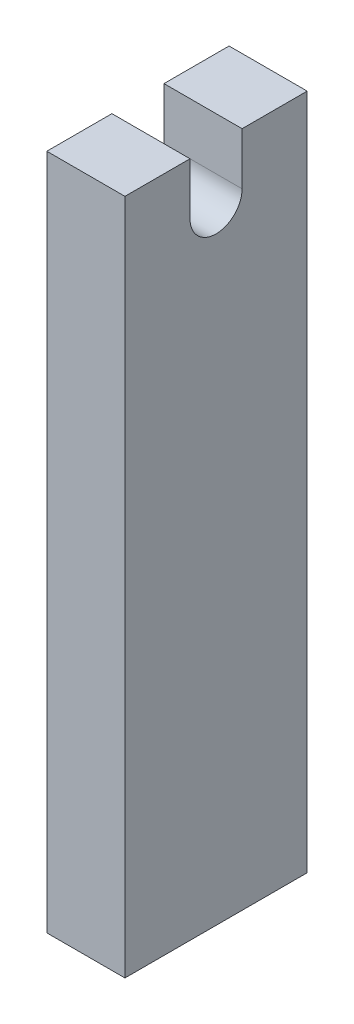
ISO-10303-21;
HEADER;
FILE_DESCRIPTION(('STEP AP214'),'2;1');
FILE_NAME('part.step','',(''),(''),'','','');
FILE_SCHEMA(('AUTOMOTIVE_DESIGN { 1 0 10303 214 1 1 1 1 }'));
ENDSEC;
DATA;
#1=APPLICATION_CONTEXT('core data for automotive mechanical design processes');
#2=APPLICATION_PROTOCOL_DEFINITION('international standard','automotive_design',2000,#1);
#3=PRODUCT_CONTEXT('',#1,'mechanical');
#4=PRODUCT('Part','Part','',(#3));
#5=PRODUCT_RELATED_PRODUCT_CATEGORY('part','',(#4));
#6=PRODUCT_DEFINITION_FORMATION('','',#4);
#7=PRODUCT_DEFINITION_CONTEXT('part definition',#1,'design');
#8=PRODUCT_DEFINITION('design','',#6,#7);
#9=PRODUCT_DEFINITION_SHAPE('','',#8);
#10=(LENGTH_UNIT() NAMED_UNIT(*) SI_UNIT(.MILLI.,.METRE.));
#11=(NAMED_UNIT(*) PLANE_ANGLE_UNIT() SI_UNIT($,.RADIAN.));
#12=(NAMED_UNIT(*) SI_UNIT($,.STERADIAN.) SOLID_ANGLE_UNIT());
#13=UNCERTAINTY_MEASURE_WITH_UNIT(LENGTH_MEASURE(1.E-05),#10,'distance_accuracy_value','');
#14=(GEOMETRIC_REPRESENTATION_CONTEXT(3) GLOBAL_UNCERTAINTY_ASSIGNED_CONTEXT((#13)) GLOBAL_UNIT_ASSIGNED_CONTEXT((#10,
#11,#12)) REPRESENTATION_CONTEXT('',''));
#15=CARTESIAN_POINT('',(0.,0.,0.));
#16=DIRECTION('',(0.,0.,1.));
#17=DIRECTION('',(1.,0.,0.));
#18=AXIS2_PLACEMENT_3D('',#15,#16,#17);
#19=CARTESIAN_POINT('',(0.,330.2,0.));
#20=DIRECTION('',(0.,-1.,0.));
#21=DIRECTION('',(0.,0.,-1.));
#22=AXIS2_PLACEMENT_3D('',#19,#20,#21);
#23=PLANE('',#22);
#24=DIRECTION('',(0.,0.,1.));
#25=VECTOR('',#24,1.);
#26=CARTESIAN_POINT('',(0.,330.2,0.));
#27=LINE('',#26,#25);
#28=CARTESIAN_POINT('',(0.,330.2,-88.9));
#29=VERTEX_POINT('',#28);
#30=CARTESIAN_POINT('',(0.,330.2,-57.15));
#31=VERTEX_POINT('',#30);
#32=EDGE_CURVE('E181',#29,#31,#27,.T.);
#33=ORIENTED_EDGE('',*,*,#32,.T.);
#34=DIRECTION('',(1.,0.,0.));
#35=VECTOR('',#34,1.);
#36=CARTESIAN_POINT('',(0.,330.2,-57.15));
#37=LINE('',#36,#35);
#38=CARTESIAN_POINT('',(38.1,330.2,-57.15));
#39=VERTEX_POINT('',#38);
#40=EDGE_CURVE('E11',#31,#39,#37,.T.);
#41=ORIENTED_EDGE('',*,*,#40,.T.);
#42=DIRECTION('',(0.,0.,-1.));
#43=VECTOR('',#42,1.);
#44=CARTESIAN_POINT('',(38.1,330.2,0.));
#45=LINE('',#44,#43);
#46=CARTESIAN_POINT('',(38.1,330.2,-88.9));
#47=VERTEX_POINT('',#46);
#48=EDGE_CURVE('E136',#39,#47,#45,.T.);
#49=ORIENTED_EDGE('',*,*,#48,.T.);
#50=DIRECTION('',(-1.,0.,0.));
#51=VECTOR('',#50,1.);
#52=CARTESIAN_POINT('',(0.,330.2,-88.9));
#53=LINE('',#52,#51);
#54=EDGE_CURVE('E64',#47,#29,#53,.T.);
#55=ORIENTED_EDGE('',*,*,#54,.T.);
#56=EDGE_LOOP('',(#33,#41,#49,#55));
#57=FACE_BOUND('',#56,.T.);
#58=ADVANCED_FACE('F39',(#57),#23,.F.);
#59=CARTESIAN_POINT('',(0.,330.2,0.));
#60=DIRECTION('',(1.,0.,0.));
#61=DIRECTION('',(0.,0.,-1.));
#62=AXIS2_PLACEMENT_3D('',#59,#60,#61);
#63=PLANE('',#62);
#64=CARTESIAN_POINT('',(0.,304.8,-44.45));
#65=DIRECTION('',(1.,0.,0.));
#66=DIRECTION('',(0.,0.,-1.));
#67=AXIS2_PLACEMENT_3D('',#64,#65,#66);
#68=CIRCLE('',#67,12.7);
#69=CARTESIAN_POINT('',(0.,304.8,-31.75));
#70=VERTEX_POINT('',#69);
#71=CARTESIAN_POINT('',(0.,304.8,-57.15));
#72=VERTEX_POINT('',#71);
#73=EDGE_CURVE('E150',#70,#72,#68,.T.);
#74=ORIENTED_EDGE('',*,*,#73,.T.);
#75=DIRECTION('',(0.,1.,0.));
#76=VECTOR('',#75,1.);
#77=CARTESIAN_POINT('',(0.,330.2,-57.15));
#78=LINE('',#77,#76);
#79=EDGE_CURVE('E182',#72,#31,#78,.T.);
#80=ORIENTED_EDGE('',*,*,#79,.T.);
#81=ORIENTED_EDGE('',*,*,#32,.F.);
#82=DIRECTION('',(0.,-1.,0.));
#83=VECTOR('',#82,1.);
#84=CARTESIAN_POINT('',(0.,330.2,-88.9));
#85=LINE('',#84,#83);
#86=CARTESIAN_POINT('',(0.,0.,-88.9));
#87=VERTEX_POINT('',#86);
#88=EDGE_CURVE('E140',#29,#87,#85,.T.);
#89=ORIENTED_EDGE('',*,*,#88,.T.);
#90=DIRECTION('',(0.,0.,1.));
#91=VECTOR('',#90,1.);
#92=CARTESIAN_POINT('',(0.,0.,0.));
#93=LINE('',#92,#91);
#94=CARTESIAN_POINT('',(0.,0.,0.));
#95=VERTEX_POINT('',#94);
#96=EDGE_CURVE('E145',#87,#95,#93,.T.);
#97=ORIENTED_EDGE('',*,*,#96,.T.);
#98=DIRECTION('',(0.,-1.,0.));
#99=VECTOR('',#98,1.);
#100=CARTESIAN_POINT('',(0.,330.2,0.));
#101=LINE('',#100,#99);
#102=CARTESIAN_POINT('',(0.,330.2,0.));
#103=VERTEX_POINT('',#102);
#104=EDGE_CURVE('E120',#103,#95,#101,.T.);
#105=ORIENTED_EDGE('',*,*,#104,.F.);
#106=CARTESIAN_POINT('',(0.,330.2,-31.75));
#107=VERTEX_POINT('',#106);
#108=EDGE_CURVE('E92',#107,#103,#27,.T.);
#109=ORIENTED_EDGE('',*,*,#108,.F.);
#110=DIRECTION('',(0.,-1.,0.));
#111=VECTOR('',#110,1.);
#112=CARTESIAN_POINT('',(0.,330.2,-31.75));
#113=LINE('',#112,#111);
#114=EDGE_CURVE('E55',#107,#70,#113,.T.);
#115=ORIENTED_EDGE('',*,*,#114,.T.);
#116=EDGE_LOOP('',(#74,#80,#81,#89,#97,#105,#109,#115));
#117=FACE_BOUND('',#116,.T.);
#118=ADVANCED_FACE('F41',(#117),#63,.F.);
#119=CARTESIAN_POINT('',(0.,330.2,0.));
#120=DIRECTION('',(0.,0.,-1.));
#121=DIRECTION('',(-1.,0.,0.));
#122=AXIS2_PLACEMENT_3D('',#119,#120,#121);
#123=PLANE('',#122);
#124=DIRECTION('',(1.,0.,0.));
#125=VECTOR('',#124,1.);
#126=CARTESIAN_POINT('',(0.,0.,0.));
#127=LINE('',#126,#125);
#128=CARTESIAN_POINT('',(38.1,0.,0.));
#129=VERTEX_POINT('',#128);
#130=EDGE_CURVE('E149',#95,#129,#127,.T.);
#131=ORIENTED_EDGE('',*,*,#130,.T.);
#132=DIRECTION('',(0.,-1.,0.));
#133=VECTOR('',#132,1.);
#134=CARTESIAN_POINT('',(38.1,330.2,0.));
#135=LINE('',#134,#133);
#136=CARTESIAN_POINT('',(38.1,330.2,0.));
#137=VERTEX_POINT('',#136);
#138=EDGE_CURVE('E163',#137,#129,#135,.T.);
#139=ORIENTED_EDGE('',*,*,#138,.F.);
#140=DIRECTION('',(1.,0.,0.));
#141=VECTOR('',#140,1.);
#142=CARTESIAN_POINT('',(0.,330.2,0.));
#143=LINE('',#142,#141);
#144=EDGE_CURVE('E133',#103,#137,#143,.T.);
#145=ORIENTED_EDGE('',*,*,#144,.F.);
#146=ORIENTED_EDGE('',*,*,#104,.T.);
#147=EDGE_LOOP('',(#131,#139,#145,#146));
#148=FACE_BOUND('',#147,.T.);
#149=ADVANCED_FACE('F170',(#148),#123,.F.);
#150=CARTESIAN_POINT('',(38.1,330.2,0.));
#151=DIRECTION('',(-1.,0.,0.));
#152=DIRECTION('',(0.,0.,1.));
#153=AXIS2_PLACEMENT_3D('',#150,#151,#152);
#154=PLANE('',#153);
#155=ORIENTED_EDGE('',*,*,#48,.F.);
#156=DIRECTION('',(0.,1.,0.));
#157=VECTOR('',#156,1.);
#158=CARTESIAN_POINT('',(38.1,330.2,-57.15));
#159=LINE('',#158,#157);
#160=CARTESIAN_POINT('',(38.1,304.8,-57.15));
#161=VERTEX_POINT('',#160);
#162=EDGE_CURVE('E197',#161,#39,#159,.T.);
#163=ORIENTED_EDGE('',*,*,#162,.F.);
#164=CARTESIAN_POINT('',(38.1,304.8,-44.45));
#165=DIRECTION('',(1.,0.,0.));
#166=DIRECTION('',(0.,0.,-1.));
#167=AXIS2_PLACEMENT_3D('',#164,#165,#166);
#168=CIRCLE('',#167,12.7);
#169=CARTESIAN_POINT('',(38.1,304.8,-31.75));
#170=VERTEX_POINT('',#169);
#171=EDGE_CURVE('E129',#170,#161,#168,.T.);
#172=ORIENTED_EDGE('',*,*,#171,.F.);
#173=DIRECTION('',(0.,-1.,0.));
#174=VECTOR('',#173,1.);
#175=CARTESIAN_POINT('',(38.1,330.2,-31.75));
#176=LINE('',#175,#174);
#177=CARTESIAN_POINT('',(38.1,330.2,-31.75));
#178=VERTEX_POINT('',#177);
#179=EDGE_CURVE('E116',#178,#170,#176,.T.);
#180=ORIENTED_EDGE('',*,*,#179,.F.);
#181=EDGE_CURVE('E126',#137,#178,#45,.T.);
#182=ORIENTED_EDGE('',*,*,#181,.F.);
#183=ORIENTED_EDGE('',*,*,#138,.T.);
#184=DIRECTION('',(0.,0.,-1.));
#185=VECTOR('',#184,1.);
#186=CARTESIAN_POINT('',(38.1,0.,0.));
#187=LINE('',#186,#185);
#188=CARTESIAN_POINT('',(38.1,0.,-88.9));
#189=VERTEX_POINT('',#188);
#190=EDGE_CURVE('E153',#129,#189,#187,.T.);
#191=ORIENTED_EDGE('',*,*,#190,.T.);
#192=DIRECTION('',(0.,-1.,0.));
#193=VECTOR('',#192,1.);
#194=CARTESIAN_POINT('',(38.1,330.2,-88.9));
#195=LINE('',#194,#193);
#196=EDGE_CURVE('E160',#47,#189,#195,.T.);
#197=ORIENTED_EDGE('',*,*,#196,.F.);
#198=EDGE_LOOP('',(#155,#163,#172,#180,#182,#183,#191,#197));
#199=FACE_BOUND('',#198,.T.);
#200=ADVANCED_FACE('F124',(#199),#154,.F.);
#201=CARTESIAN_POINT('',(0.,330.2,-88.9));
#202=DIRECTION('',(0.,0.,1.));
#203=DIRECTION('',(1.,0.,0.));
#204=AXIS2_PLACEMENT_3D('',#201,#202,#203);
#205=PLANE('',#204);
#206=DIRECTION('',(-1.,0.,0.));
#207=VECTOR('',#206,1.);
#208=CARTESIAN_POINT('',(0.,0.,-88.9));
#209=LINE('',#208,#207);
#210=EDGE_CURVE('E85',#189,#87,#209,.T.);
#211=ORIENTED_EDGE('',*,*,#210,.T.);
#212=ORIENTED_EDGE('',*,*,#88,.F.);
#213=ORIENTED_EDGE('',*,*,#54,.F.);
#214=ORIENTED_EDGE('',*,*,#196,.T.);
#215=EDGE_LOOP('',(#211,#212,#213,#214));
#216=FACE_BOUND('',#215,.T.);
#217=ADVANCED_FACE('F179',(#216),#205,.F.);
#218=ORIENTED_EDGE('',*,*,#181,.T.);
#219=DIRECTION('',(-1.,0.,0.));
#220=VECTOR('',#219,1.);
#221=CARTESIAN_POINT('',(0.,330.2,-31.75));
#222=LINE('',#221,#220);
#223=EDGE_CURVE('E48',#178,#107,#222,.T.);
#224=ORIENTED_EDGE('',*,*,#223,.T.);
#225=ORIENTED_EDGE('',*,*,#108,.T.);
#226=ORIENTED_EDGE('',*,*,#144,.T.);
#227=EDGE_LOOP('',(#218,#224,#225,#226));
#228=FACE_BOUND('',#227,.T.);
#229=ADVANCED_FACE('F132',(#228),#23,.F.);
#230=CARTESIAN_POINT('',(0.,0.,0.));
#231=DIRECTION('',(0.,-1.,0.));
#232=DIRECTION('',(0.,0.,-1.));
#233=AXIS2_PLACEMENT_3D('',#230,#231,#232);
#234=PLANE('',#233);
#235=ORIENTED_EDGE('',*,*,#96,.F.);
#236=ORIENTED_EDGE('',*,*,#210,.F.);
#237=ORIENTED_EDGE('',*,*,#190,.F.);
#238=ORIENTED_EDGE('',*,*,#130,.F.);
#239=EDGE_LOOP('',(#235,#236,#237,#238));
#240=FACE_BOUND('',#239,.T.);
#241=ADVANCED_FACE('F176',(#240),#234,.T.);
#242=CARTESIAN_POINT('',(-342.9,304.8,-44.45));
#243=DIRECTION('',(1.,0.,0.));
#244=DIRECTION('',(0.,0.,-1.));
#245=AXIS2_PLACEMENT_3D('',#242,#243,#244);
#246=CYLINDRICAL_SURFACE('',#245,12.7);
#247=DIRECTION('',(1.,0.,0.));
#248=VECTOR('',#247,1.);
#249=CARTESIAN_POINT('',(-342.9,304.8,-31.75));
#250=LINE('',#249,#248);
#251=EDGE_CURVE('E194',#70,#170,#250,.T.);
#252=ORIENTED_EDGE('',*,*,#251,.T.);
#253=ORIENTED_EDGE('',*,*,#171,.T.);
#254=DIRECTION('',(1.,0.,0.));
#255=VECTOR('',#254,1.);
#256=CARTESIAN_POINT('',(-342.9,304.8,-57.15));
#257=LINE('',#256,#255);
#258=EDGE_CURVE('E193',#72,#161,#257,.T.);
#259=ORIENTED_EDGE('',*,*,#258,.F.);
#260=ORIENTED_EDGE('',*,*,#73,.F.);
#261=EDGE_LOOP('',(#252,#253,#259,#260));
#262=FACE_BOUND('',#261,.T.);
#263=ADVANCED_FACE('F205',(#262),#246,.F.);
#264=CARTESIAN_POINT('',(-342.9,330.2,-57.15));
#265=DIRECTION('',(0.,0.,-1.));
#266=DIRECTION('',(-1.,0.,0.));
#267=AXIS2_PLACEMENT_3D('',#264,#265,#266);
#268=PLANE('',#267);
#269=ORIENTED_EDGE('',*,*,#258,.T.);
#270=ORIENTED_EDGE('',*,*,#162,.T.);
#271=ORIENTED_EDGE('',*,*,#40,.F.);
#272=ORIENTED_EDGE('',*,*,#79,.F.);
#273=EDGE_LOOP('',(#269,#270,#271,#272));
#274=FACE_BOUND('',#273,.T.);
#275=ADVANCED_FACE('F207',(#274),#268,.F.);
#276=CARTESIAN_POINT('',(-342.9,330.2,-31.75));
#277=DIRECTION('',(0.,0.,1.));
#278=DIRECTION('',(1.,0.,0.));
#279=AXIS2_PLACEMENT_3D('',#276,#277,#278);
#280=PLANE('',#279);
#281=ORIENTED_EDGE('',*,*,#223,.F.);
#282=ORIENTED_EDGE('',*,*,#179,.T.);
#283=ORIENTED_EDGE('',*,*,#251,.F.);
#284=ORIENTED_EDGE('',*,*,#114,.F.);
#285=EDGE_LOOP('',(#281,#282,#283,#284));
#286=FACE_BOUND('',#285,.T.);
#287=ADVANCED_FACE('F115',(#286),#280,.F.);
#288=CLOSED_SHELL('',(#58,#118,#149,#200,#217,#229,#241,#263,#275,#287));
#289=MANIFOLD_SOLID_BREP('B2',#288);
#290=ADVANCED_BREP_SHAPE_REPRESENTATION('',(#18,#289),#14);
#291=SHAPE_DEFINITION_REPRESENTATION(#9,#290);
ENDSEC;
END-ISO-10303-21;
